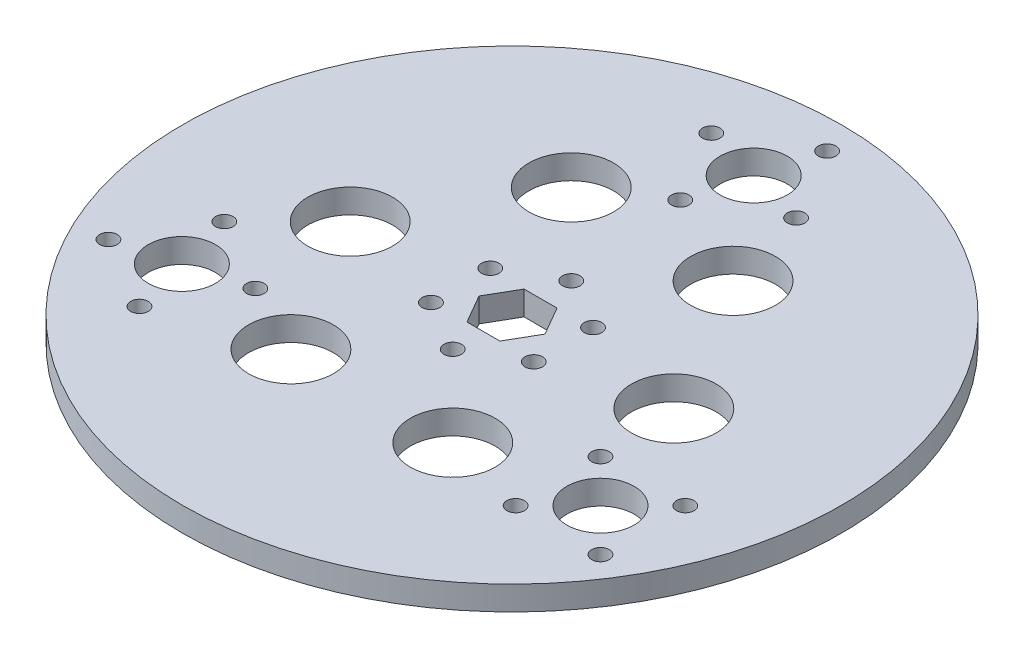
ISO-10303-21;
HEADER;
FILE_DESCRIPTION(('STEP AP214'),'2;1');
FILE_NAME('part.step','',(''),(''),'','','');
FILE_SCHEMA(('AUTOMOTIVE_DESIGN { 1 0 10303 214 1 1 1 1 }'));
ENDSEC;
DATA;
#1=APPLICATION_CONTEXT('core data for automotive mechanical design processes');
#2=APPLICATION_PROTOCOL_DEFINITION('international standard','automotive_design',2000,#1);
#3=PRODUCT_CONTEXT('',#1,'mechanical');
#4=PRODUCT('Part','Part','',(#3));
#5=PRODUCT_RELATED_PRODUCT_CATEGORY('part','',(#4));
#6=PRODUCT_DEFINITION_FORMATION('','',#4);
#7=PRODUCT_DEFINITION_CONTEXT('part definition',#1,'design');
#8=PRODUCT_DEFINITION('design','',#6,#7);
#9=PRODUCT_DEFINITION_SHAPE('','',#8);
#10=(LENGTH_UNIT() NAMED_UNIT(*) SI_UNIT(.MILLI.,.METRE.));
#11=(NAMED_UNIT(*) PLANE_ANGLE_UNIT() SI_UNIT($,.RADIAN.));
#12=(NAMED_UNIT(*) SI_UNIT($,.STERADIAN.) SOLID_ANGLE_UNIT());
#13=UNCERTAINTY_MEASURE_WITH_UNIT(LENGTH_MEASURE(1.E-05),#10,'distance_accuracy_value','');
#14=(GEOMETRIC_REPRESENTATION_CONTEXT(3) GLOBAL_UNCERTAINTY_ASSIGNED_CONTEXT((#13)) GLOBAL_UNIT_ASSIGNED_CONTEXT((#10,
#11,#12)) REPRESENTATION_CONTEXT('',''));
#15=CARTESIAN_POINT('',(0.,0.,0.));
#16=DIRECTION('',(0.,0.,1.));
#17=DIRECTION('',(1.,0.,0.));
#18=AXIS2_PLACEMENT_3D('',#15,#16,#17);
#19=CARTESIAN_POINT('',(0.,5.5,0.));
#20=DIRECTION('',(0.,1.,0.));
#21=DIRECTION('',(0.,0.,1.));
#22=AXIS2_PLACEMENT_3D('',#19,#20,#21);
#23=PLANE('',#22);
#24=CARTESIAN_POINT('',(-13.1848875288454,5.5,-58.5328799656496));
#25=DIRECTION('',(0.,1.,0.));
#26=DIRECTION('',(0.,0.,1.));
#27=AXIS2_PLACEMENT_3D('',#24,#25,#26);
#28=CIRCLE('',#27,2.);
#29=CARTESIAN_POINT('',(-13.1848875288454,5.5,-56.5328799656496));
#30=VERTEX_POINT('',#29);
#31=EDGE_CURVE('E208',#30,#30,#28,.T.);
#32=ORIENTED_EDGE('',*,*,#31,.F.);
#33=EDGE_LOOP('',(#32));
#34=FACE_BOUND('',#33,.T.);
#35=CARTESIAN_POINT('',(13.1848875288461,5.5,-51.4671200343505));
#36=DIRECTION('',(0.,1.,0.));
#37=DIRECTION('',(0.,0.,1.));
#38=AXIS2_PLACEMENT_3D('',#35,#36,#37);
#39=CIRCLE('',#38,2.);
#40=CARTESIAN_POINT('',(13.1848875288461,5.5,-49.4671200343505));
#41=VERTEX_POINT('',#40);
#42=EDGE_CURVE('E212',#41,#41,#39,.T.);
#43=ORIENTED_EDGE('',*,*,#42,.F.);
#44=EDGE_LOOP('',(#43));
#45=FACE_BOUND('',#44,.T.);
#46=CARTESIAN_POINT('',(-44.0985172424949,5.5,40.6848875288457));
#47=DIRECTION('',(0.,1.,0.));
#48=DIRECTION('',(0.,0.,1.));
#49=AXIS2_PLACEMENT_3D('',#46,#47,#48);
#50=CIRCLE('',#49,2.);
#51=CARTESIAN_POINT('',(-44.0985172424949,5.5,42.6848875288457));
#52=VERTEX_POINT('',#51);
#53=EDGE_CURVE('E216',#52,#52,#50,.T.);
#54=ORIENTED_EDGE('',*,*,#53,.F.);
#55=EDGE_LOOP('',(#54));
#56=FACE_BOUND('',#55,.T.);
#57=CARTESIAN_POINT('',(-51.1642771737935,5.5,14.3151124711541));
#58=DIRECTION('',(0.,1.,0.));
#59=DIRECTION('',(0.,0.,1.));
#60=AXIS2_PLACEMENT_3D('',#57,#58,#59);
#61=CIRCLE('',#60,2.00000000000001);
#62=CARTESIAN_POINT('',(-51.1642771737935,5.5,16.3151124711541));
#63=VERTEX_POINT('',#62);
#64=EDGE_CURVE('E220',#63,#63,#61,.T.);
#65=ORIENTED_EDGE('',*,*,#64,.F.);
#66=EDGE_LOOP('',(#65));
#67=FACE_BOUND('',#66,.T.);
#68=CARTESIAN_POINT('',(57.2834047713406,5.5,17.8479924368036));
#69=DIRECTION('',(0.,1.,0.));
#70=DIRECTION('',(0.,0.,1.));
#71=AXIS2_PLACEMENT_3D('',#68,#69,#70);
#72=CIRCLE('',#71,2.);
#73=CARTESIAN_POINT('',(57.2834047713406,5.5,19.8479924368036));
#74=VERTEX_POINT('',#73);
#75=EDGE_CURVE('E224',#74,#74,#72,.T.);
#76=ORIENTED_EDGE('',*,*,#75,.F.);
#77=EDGE_LOOP('',(#76));
#78=FACE_BOUND('',#77,.T.);
#79=CARTESIAN_POINT('',(37.9793896449478,5.5,37.1520075631962));
#80=DIRECTION('',(0.,1.,0.));
#81=DIRECTION('',(0.,0.,1.));
#82=AXIS2_PLACEMENT_3D('',#79,#80,#81);
#83=CIRCLE('',#82,2.);
#84=CARTESIAN_POINT('',(37.9793896449478,5.5,39.1520075631962));
#85=VERTEX_POINT('',#84);
#86=EDGE_CURVE('E228',#85,#85,#83,.T.);
#87=ORIENTED_EDGE('',*,*,#86,.F.);
#88=EDGE_LOOP('',(#87));
#89=FACE_BOUND('',#88,.T.);
#90=CARTESIAN_POINT('',(-11.6913429510899,5.5,-6.74999999999999));
#91=DIRECTION('',(0.,1.,0.));
#92=DIRECTION('',(0.,0.,1.));
#93=AXIS2_PLACEMENT_3D('',#90,#91,#92);
#94=CIRCLE('',#93,2.);
#95=CARTESIAN_POINT('',(-11.6913429510899,5.5,-4.74999999999999));
#96=VERTEX_POINT('',#95);
#97=EDGE_CURVE('E232',#96,#96,#94,.T.);
#98=ORIENTED_EDGE('',*,*,#97,.F.);
#99=EDGE_LOOP('',(#98));
#100=FACE_BOUND('',#99,.T.);
#101=CARTESIAN_POINT('',(0.,5.5,13.5));
#102=DIRECTION('',(0.,1.,0.));
#103=DIRECTION('',(0.,0.,1.));
#104=AXIS2_PLACEMENT_3D('',#101,#102,#103);
#105=CIRCLE('',#104,2.00000000000012);
#106=CARTESIAN_POINT('',(0.,5.5,15.5000000000001));
#107=VERTEX_POINT('',#106);
#108=EDGE_CURVE('E236',#107,#107,#105,.T.);
#109=ORIENTED_EDGE('',*,*,#108,.F.);
#110=EDGE_LOOP('',(#109));
#111=FACE_BOUND('',#110,.T.);
#112=CARTESIAN_POINT('',(11.6913429510899,5.5,-6.75));
#113=DIRECTION('',(0.,1.,0.));
#114=DIRECTION('',(0.,0.,1.));
#115=AXIS2_PLACEMENT_3D('',#112,#113,#114);
#116=CIRCLE('',#115,2.);
#117=CARTESIAN_POINT('',(11.6913429510899,5.5,-4.75));
#118=VERTEX_POINT('',#117);
#119=EDGE_CURVE('E240',#118,#118,#116,.T.);
#120=ORIENTED_EDGE('',*,*,#119,.F.);
#121=EDGE_LOOP('',(#120));
#122=FACE_BOUND('',#121,.T.);
#123=CARTESIAN_POINT('',(0.,5.5,-13.5));
#124=DIRECTION('',(0.,1.,0.));
#125=DIRECTION('',(0.,0.,1.));
#126=AXIS2_PLACEMENT_3D('',#123,#124,#125);
#127=CIRCLE('',#126,2.);
#128=CARTESIAN_POINT('',(0.,5.5,-11.5));
#129=VERTEX_POINT('',#128);
#130=EDGE_CURVE('E120',#129,#129,#127,.T.);
#131=ORIENTED_EDGE('',*,*,#130,.F.);
#132=EDGE_LOOP('',(#131));
#133=FACE_BOUND('',#132,.T.);
#134=CARTESIAN_POINT('',(18.4136960905577,5.5,31.8934571839783));
#135=DIRECTION('',(0.,1.,0.));
#136=DIRECTION('',(0.,0.,1.));
#137=AXIS2_PLACEMENT_3D('',#134,#135,#136);
#138=CIRCLE('',#137,9.65);
#139=CARTESIAN_POINT('',(18.4136960905577,5.5,41.5434571839783));
#140=VERTEX_POINT('',#139);
#141=EDGE_CURVE('E146',#140,#140,#138,.T.);
#142=ORIENTED_EDGE('',*,*,#141,.F.);
#143=EDGE_LOOP('',(#142));
#144=FACE_BOUND('',#143,.T.);
#145=CARTESIAN_POINT('',(18.4136960905577,5.5,-31.8934571839783));
#146=DIRECTION('',(0.,1.,0.));
#147=DIRECTION('',(0.,0.,1.));
#148=AXIS2_PLACEMENT_3D('',#145,#146,#147);
#149=CIRCLE('',#148,9.65000000000001);
#150=CARTESIAN_POINT('',(18.4136960905577,5.5,-22.2434571839783));
#151=VERTEX_POINT('',#150);
#152=EDGE_CURVE('E158',#151,#151,#149,.T.);
#153=ORIENTED_EDGE('',*,*,#152,.F.);
#154=EDGE_LOOP('',(#153));
#155=FACE_BOUND('',#154,.T.);
#156=CARTESIAN_POINT('',(-18.4136960905577,5.5,-31.8934571839783));
#157=DIRECTION('',(0.,1.,0.));
#158=DIRECTION('',(0.,0.,1.));
#159=AXIS2_PLACEMENT_3D('',#156,#157,#158);
#160=CIRCLE('',#159,9.65);
#161=CARTESIAN_POINT('',(-18.4136960905577,5.5,-22.2434571839783));
#162=VERTEX_POINT('',#161);
#163=EDGE_CURVE('E170',#162,#162,#160,.T.);
#164=ORIENTED_EDGE('',*,*,#163,.F.);
#165=EDGE_LOOP('',(#164));
#166=FACE_BOUND('',#165,.T.);
#167=CARTESIAN_POINT('',(0.,5.5,0.));
#168=DIRECTION('',(0.,1.,0.));
#169=DIRECTION('',(0.,0.,1.));
#170=AXIS2_PLACEMENT_3D('',#167,#168,#169);
#171=CIRCLE('',#170,75.);
#172=CARTESIAN_POINT('',(0.,5.5,75.));
#173=VERTEX_POINT('',#172);
#174=EDGE_CURVE('E11',#173,#173,#171,.T.);
#175=ORIENTED_EDGE('',*,*,#174,.T.);
#176=EDGE_LOOP('',(#175));
#177=FACE_BOUND('',#176,.T.);
#178=CARTESIAN_POINT('',(-36.8273921811154,5.5,0.));
#179=DIRECTION('',(0.,1.,0.));
#180=DIRECTION('',(0.,0.,1.));
#181=AXIS2_PLACEMENT_3D('',#178,#179,#180);
#182=CIRCLE('',#181,9.65);
#183=CARTESIAN_POINT('',(-36.8273921811154,5.5,9.65000000000001));
#184=VERTEX_POINT('',#183);
#185=EDGE_CURVE('E176',#184,#184,#182,.T.);
#186=ORIENTED_EDGE('',*,*,#185,.F.);
#187=EDGE_LOOP('',(#186));
#188=FACE_BOUND('',#187,.T.);
#189=CARTESIAN_POINT('',(0.,5.5,-55.));
#190=DIRECTION('',(0.,1.,0.));
#191=DIRECTION('',(0.,0.,1.));
#192=AXIS2_PLACEMENT_3D('',#189,#190,#191);
#193=CIRCLE('',#192,7.65);
#194=CARTESIAN_POINT('',(0.,5.5,-47.35));
#195=VERTEX_POINT('',#194);
#196=EDGE_CURVE('E164',#195,#195,#193,.T.);
#197=ORIENTED_EDGE('',*,*,#196,.F.);
#198=EDGE_LOOP('',(#197));
#199=FACE_BOUND('',#198,.T.);
#200=CARTESIAN_POINT('',(36.8273921811154,5.5,0.));
#201=DIRECTION('',(0.,1.,0.));
#202=DIRECTION('',(0.,0.,1.));
#203=AXIS2_PLACEMENT_3D('',#200,#201,#202);
#204=CIRCLE('',#203,9.65000000000001);
#205=CARTESIAN_POINT('',(36.8273921811154,5.5,9.64999999999999));
#206=VERTEX_POINT('',#205);
#207=EDGE_CURVE('E152',#206,#206,#204,.T.);
#208=ORIENTED_EDGE('',*,*,#207,.F.);
#209=EDGE_LOOP('',(#208));
#210=FACE_BOUND('',#209,.T.);
#211=CARTESIAN_POINT('',(-18.4136960905577,5.5,31.8934571839784));
#212=DIRECTION('',(0.,1.,0.));
#213=DIRECTION('',(0.,0.,1.));
#214=AXIS2_PLACEMENT_3D('',#211,#212,#213);
#215=CIRCLE('',#214,9.65000000000001);
#216=CARTESIAN_POINT('',(-18.4136960905577,5.5,41.5434571839784));
#217=VERTEX_POINT('',#216);
#218=EDGE_CURVE('E140',#217,#217,#215,.T.);
#219=ORIENTED_EDGE('',*,*,#218,.F.);
#220=EDGE_LOOP('',(#219));
#221=FACE_BOUND('',#220,.T.);
#222=DIRECTION('',(0.5,0.,-0.866025403784439));
#223=VECTOR('',#222,1.);
#224=CARTESIAN_POINT('',(3.75277674973257,5.5,6.5));
#225=LINE('',#224,#223);
#226=CARTESIAN_POINT('',(3.75277674973257,5.5,6.5));
#227=VERTEX_POINT('',#226);
#228=CARTESIAN_POINT('',(7.50555349946513,5.5,0.));
#229=VERTEX_POINT('',#228);
#230=EDGE_CURVE('E94',#227,#229,#225,.T.);
#231=ORIENTED_EDGE('',*,*,#230,.F.);
#232=DIRECTION('',(1.,0.,0.));
#233=VECTOR('',#232,1.);
#234=CARTESIAN_POINT('',(-3.75277674973257,5.5,6.5));
#235=LINE('',#234,#233);
#236=CARTESIAN_POINT('',(-3.75277674973257,5.5,6.5));
#237=VERTEX_POINT('',#236);
#238=EDGE_CURVE('E86',#237,#227,#235,.T.);
#239=ORIENTED_EDGE('',*,*,#238,.F.);
#240=DIRECTION('',(0.5,0.,0.866025403784439));
#241=VECTOR('',#240,1.);
#242=CARTESIAN_POINT('',(-7.50555349946513,5.5,0.));
#243=LINE('',#242,#241);
#244=CARTESIAN_POINT('',(-7.50555349946513,5.5,0.));
#245=VERTEX_POINT('',#244);
#246=EDGE_CURVE('E117',#245,#237,#243,.T.);
#247=ORIENTED_EDGE('',*,*,#246,.F.);
#248=DIRECTION('',(-0.5,0.,0.866025403784439));
#249=VECTOR('',#248,1.);
#250=CARTESIAN_POINT('',(-3.75277674973257,5.5,-6.5));
#251=LINE('',#250,#249);
#252=CARTESIAN_POINT('',(-3.75277674973257,5.5,-6.5));
#253=VERTEX_POINT('',#252);
#254=EDGE_CURVE('E115',#253,#245,#251,.T.);
#255=ORIENTED_EDGE('',*,*,#254,.F.);
#256=DIRECTION('',(-1.,0.,0.));
#257=VECTOR('',#256,1.);
#258=CARTESIAN_POINT('',(3.75277674973256,5.5,-6.5));
#259=LINE('',#258,#257);
#260=CARTESIAN_POINT('',(3.75277674973256,5.5,-6.5));
#261=VERTEX_POINT('',#260);
#262=EDGE_CURVE('E110',#261,#253,#259,.T.);
#263=ORIENTED_EDGE('',*,*,#262,.F.);
#264=DIRECTION('',(-0.5,0.,-0.866025403784438));
#265=VECTOR('',#264,1.);
#266=CARTESIAN_POINT('',(7.50555349946513,5.5,0.));
#267=LINE('',#266,#265);
#268=EDGE_CURVE('E108',#229,#261,#267,.T.);
#269=ORIENTED_EDGE('',*,*,#268,.F.);
#270=EDGE_LOOP('',(#231,#239,#247,#255,#263,#269));
#271=FACE_BOUND('',#270,.T.);
#272=CARTESIAN_POINT('',(47.6313972081483,5.5,27.4999999999976));
#273=DIRECTION('',(0.,1.,0.));
#274=DIRECTION('',(0.,0.,1.));
#275=AXIS2_PLACEMENT_3D('',#272,#273,#274);
#276=CIRCLE('',#275,7.65);
#277=CARTESIAN_POINT('',(47.6313972081483,5.5,35.1499999999976));
#278=VERTEX_POINT('',#277);
#279=EDGE_CURVE('E491',#278,#278,#276,.T.);
#280=ORIENTED_EDGE('',*,*,#279,.F.);
#281=EDGE_LOOP('',(#280));
#282=FACE_BOUND('',#281,.T.);
#283=CARTESIAN_POINT('',(11.6913429510899,5.5,6.75));
#284=DIRECTION('',(0.,1.,0.));
#285=DIRECTION('',(0.,0.,1.));
#286=AXIS2_PLACEMENT_3D('',#283,#284,#285);
#287=CIRCLE('',#286,2.00000000000009);
#288=CARTESIAN_POINT('',(11.6913429510899,5.5,8.75000000000008));
#289=VERTEX_POINT('',#288);
#290=EDGE_CURVE('E481',#289,#289,#287,.T.);
#291=ORIENTED_EDGE('',*,*,#290,.F.);
#292=EDGE_LOOP('',(#291));
#293=FACE_BOUND('',#292,.T.);
#294=CARTESIAN_POINT('',(-11.6913429510899,5.5,6.75000000000001));
#295=DIRECTION('',(0.,1.,0.));
#296=DIRECTION('',(0.,0.,1.));
#297=AXIS2_PLACEMENT_3D('',#294,#295,#296);
#298=CIRCLE('',#297,2.00000000000018);
#299=CARTESIAN_POINT('',(-11.6913429510899,5.5,8.75000000000018));
#300=VERTEX_POINT('',#299);
#301=EDGE_CURVE('E471',#300,#300,#298,.T.);
#302=ORIENTED_EDGE('',*,*,#301,.F.);
#303=EDGE_LOOP('',(#302));
#304=FACE_BOUND('',#303,.T.);
#305=CARTESIAN_POINT('',(-47.63139720814,5.5,27.5000000000024));
#306=DIRECTION('',(0.,1.,0.));
#307=DIRECTION('',(0.,0.,1.));
#308=AXIS2_PLACEMENT_3D('',#305,#306,#307);
#309=CIRCLE('',#308,7.65);
#310=CARTESIAN_POINT('',(-47.63139720814,5.5,35.1500000000024));
#311=VERTEX_POINT('',#310);
#312=EDGE_CURVE('E461',#311,#311,#309,.T.);
#313=ORIENTED_EDGE('',*,*,#312,.F.);
#314=EDGE_LOOP('',(#313));
#315=FACE_BOUND('',#314,.T.);
#316=CARTESIAN_POINT('',(37.9793896449479,5.5,17.8479924368035));
#317=DIRECTION('',(0.,1.,0.));
#318=DIRECTION('',(0.,0.,1.));
#319=AXIS2_PLACEMENT_3D('',#316,#317,#318);
#320=CIRCLE('',#319,2.00000000000001);
#321=CARTESIAN_POINT('',(37.9793896449479,5.5,19.8479924368035));
#322=VERTEX_POINT('',#321);
#323=EDGE_CURVE('E451',#322,#322,#320,.T.);
#324=ORIENTED_EDGE('',*,*,#323,.F.);
#325=EDGE_LOOP('',(#324));
#326=FACE_BOUND('',#325,.T.);
#327=CARTESIAN_POINT('',(57.2834047713405,5.5,37.1520075631963));
#328=DIRECTION('',(0.,1.,0.));
#329=DIRECTION('',(0.,0.,1.));
#330=AXIS2_PLACEMENT_3D('',#327,#328,#329);
#331=CIRCLE('',#330,2.);
#332=CARTESIAN_POINT('',(57.2834047713405,5.5,39.1520075631964));
#333=VERTEX_POINT('',#332);
#334=EDGE_CURVE('E441',#333,#333,#331,.T.);
#335=ORIENTED_EDGE('',*,*,#334,.F.);
#336=EDGE_LOOP('',(#335));
#337=FACE_BOUND('',#336,.T.);
#338=CARTESIAN_POINT('',(-34.4465096792984,5.5,23.9671200343506));
#339=DIRECTION('',(0.,1.,0.));
#340=DIRECTION('',(0.,0.,1.));
#341=AXIS2_PLACEMENT_3D('',#338,#339,#340);
#342=CIRCLE('',#341,2.);
#343=CARTESIAN_POINT('',(-34.4465096792984,5.5,25.9671200343506));
#344=VERTEX_POINT('',#343);
#345=EDGE_CURVE('E431',#344,#344,#342,.T.);
#346=ORIENTED_EDGE('',*,*,#345,.F.);
#347=EDGE_LOOP('',(#346));
#348=FACE_BOUND('',#347,.T.);
#349=CARTESIAN_POINT('',(-60.81628473699,5.5,31.0328799656491));
#350=DIRECTION('',(0.,1.,0.));
#351=DIRECTION('',(0.,0.,1.));
#352=AXIS2_PLACEMENT_3D('',#349,#350,#351);
#353=CIRCLE('',#352,2.00000000000001);
#354=CARTESIAN_POINT('',(-60.81628473699,5.5,33.0328799656491));
#355=VERTEX_POINT('',#354);
#356=EDGE_CURVE('E421',#355,#355,#353,.T.);
#357=ORIENTED_EDGE('',*,*,#356,.F.);
#358=EDGE_LOOP('',(#357));
#359=FACE_BOUND('',#358,.T.);
#360=CARTESIAN_POINT('',(-3.53287996564922,5.5,-41.8151124711543));
#361=DIRECTION('',(0.,1.,0.));
#362=DIRECTION('',(0.,0.,1.));
#363=AXIS2_PLACEMENT_3D('',#360,#361,#362);
#364=CIRCLE('',#363,2.);
#365=CARTESIAN_POINT('',(-3.53287996564922,5.5,-39.8151124711543));
#366=VERTEX_POINT('',#365);
#367=EDGE_CURVE('E411',#366,#366,#364,.T.);
#368=ORIENTED_EDGE('',*,*,#367,.F.);
#369=EDGE_LOOP('',(#368));
#370=FACE_BOUND('',#369,.T.);
#371=CARTESIAN_POINT('',(3.53287996565003,5.5,-68.1848875288457));
#372=DIRECTION('',(0.,1.,0.));
#373=DIRECTION('',(0.,0.,1.));
#374=AXIS2_PLACEMENT_3D('',#371,#372,#373);
#375=CIRCLE('',#374,2.);
#376=CARTESIAN_POINT('',(3.53287996565003,5.5,-66.1848875288457));
#377=VERTEX_POINT('',#376);
#378=EDGE_CURVE('E398',#377,#377,#375,.T.);
#379=ORIENTED_EDGE('',*,*,#378,.F.);
#380=EDGE_LOOP('',(#379));
#381=FACE_BOUND('',#380,.T.);
#382=ADVANCED_FACE('F33',(#34,#45,#56,#67,#78,#89,#100,#111,#122,#133,#144,#155,#166,#177,#188,
#199,#210,#221,#271,#282,#293,#304,#315,#326,#337,#348,#359,#370,#381),#23,.T.);
#383=CARTESIAN_POINT('',(0.,0.,0.));
#384=DIRECTION('',(0.,1.,0.));
#385=DIRECTION('',(0.,0.,1.));
#386=AXIS2_PLACEMENT_3D('',#383,#384,#385);
#387=PLANE('',#386);
#388=CARTESIAN_POINT('',(-18.4136960905577,0.,31.8934571839784));
#389=DIRECTION('',(0.,1.,0.));
#390=DIRECTION('',(0.,0.,1.));
#391=AXIS2_PLACEMENT_3D('',#388,#389,#390);
#392=CIRCLE('',#391,9.65000000000001);
#393=CARTESIAN_POINT('',(-18.4136960905577,0.,41.5434571839784));
#394=VERTEX_POINT('',#393);
#395=EDGE_CURVE('E102',#394,#394,#392,.T.);
#396=ORIENTED_EDGE('',*,*,#395,.T.);
#397=EDGE_LOOP('',(#396));
#398=FACE_BOUND('',#397,.T.);
#399=CARTESIAN_POINT('',(18.4136960905577,0.,31.8934571839783));
#400=DIRECTION('',(0.,1.,0.));
#401=DIRECTION('',(0.,0.,1.));
#402=AXIS2_PLACEMENT_3D('',#399,#400,#401);
#403=CIRCLE('',#402,9.65);
#404=CARTESIAN_POINT('',(18.4136960905577,0.,41.5434571839783));
#405=VERTEX_POINT('',#404);
#406=EDGE_CURVE('E143',#405,#405,#403,.T.);
#407=ORIENTED_EDGE('',*,*,#406,.T.);
#408=EDGE_LOOP('',(#407));
#409=FACE_BOUND('',#408,.T.);
#410=CARTESIAN_POINT('',(36.8273921811154,0.,0.));
#411=DIRECTION('',(0.,1.,0.));
#412=DIRECTION('',(0.,0.,1.));
#413=AXIS2_PLACEMENT_3D('',#410,#411,#412);
#414=CIRCLE('',#413,9.65000000000001);
#415=CARTESIAN_POINT('',(36.8273921811154,0.,9.64999999999999));
#416=VERTEX_POINT('',#415);
#417=EDGE_CURVE('E149',#416,#416,#414,.T.);
#418=ORIENTED_EDGE('',*,*,#417,.T.);
#419=EDGE_LOOP('',(#418));
#420=FACE_BOUND('',#419,.T.);
#421=CARTESIAN_POINT('',(18.4136960905577,0.,-31.8934571839783));
#422=DIRECTION('',(0.,1.,0.));
#423=DIRECTION('',(0.,0.,1.));
#424=AXIS2_PLACEMENT_3D('',#421,#422,#423);
#425=CIRCLE('',#424,9.65000000000001);
#426=CARTESIAN_POINT('',(18.4136960905577,0.,-22.2434571839783));
#427=VERTEX_POINT('',#426);
#428=EDGE_CURVE('E155',#427,#427,#425,.T.);
#429=ORIENTED_EDGE('',*,*,#428,.T.);
#430=EDGE_LOOP('',(#429));
#431=FACE_BOUND('',#430,.T.);
#432=CARTESIAN_POINT('',(0.,0.,-55.));
#433=DIRECTION('',(0.,1.,0.));
#434=DIRECTION('',(0.,0.,1.));
#435=AXIS2_PLACEMENT_3D('',#432,#433,#434);
#436=CIRCLE('',#435,7.65);
#437=CARTESIAN_POINT('',(0.,0.,-47.35));
#438=VERTEX_POINT('',#437);
#439=EDGE_CURVE('E161',#438,#438,#436,.T.);
#440=ORIENTED_EDGE('',*,*,#439,.T.);
#441=EDGE_LOOP('',(#440));
#442=FACE_BOUND('',#441,.T.);
#443=CARTESIAN_POINT('',(-18.4136960905577,0.,-31.8934571839783));
#444=DIRECTION('',(0.,1.,0.));
#445=DIRECTION('',(0.,0.,1.));
#446=AXIS2_PLACEMENT_3D('',#443,#444,#445);
#447=CIRCLE('',#446,9.65);
#448=CARTESIAN_POINT('',(-18.4136960905577,0.,-22.2434571839783));
#449=VERTEX_POINT('',#448);
#450=EDGE_CURVE('E167',#449,#449,#447,.T.);
#451=ORIENTED_EDGE('',*,*,#450,.T.);
#452=EDGE_LOOP('',(#451));
#453=FACE_BOUND('',#452,.T.);
#454=CARTESIAN_POINT('',(-36.8273921811154,0.,0.));
#455=DIRECTION('',(0.,1.,0.));
#456=DIRECTION('',(0.,0.,1.));
#457=AXIS2_PLACEMENT_3D('',#454,#455,#456);
#458=CIRCLE('',#457,9.65);
#459=CARTESIAN_POINT('',(-36.8273921811154,0.,9.65000000000001));
#460=VERTEX_POINT('',#459);
#461=EDGE_CURVE('E173',#460,#460,#458,.T.);
#462=ORIENTED_EDGE('',*,*,#461,.T.);
#463=EDGE_LOOP('',(#462));
#464=FACE_BOUND('',#463,.T.);
#465=CARTESIAN_POINT('',(0.,0.,0.));
#466=DIRECTION('',(0.,1.,0.));
#467=DIRECTION('',(0.,0.,1.));
#468=AXIS2_PLACEMENT_3D('',#465,#466,#467);
#469=CIRCLE('',#468,75.);
#470=CARTESIAN_POINT('',(0.,0.,75.));
#471=VERTEX_POINT('',#470);
#472=EDGE_CURVE('E37',#471,#471,#469,.T.);
#473=ORIENTED_EDGE('',*,*,#472,.F.);
#474=EDGE_LOOP('',(#473));
#475=FACE_BOUND('',#474,.T.);
#476=DIRECTION('',(1.,0.,0.));
#477=VECTOR('',#476,1.);
#478=CARTESIAN_POINT('',(-3.75277674973257,0.,6.5));
#479=LINE('',#478,#477);
#480=CARTESIAN_POINT('',(-3.75277674973257,0.,6.5));
#481=VERTEX_POINT('',#480);
#482=CARTESIAN_POINT('',(3.75277674973257,0.,6.5));
#483=VERTEX_POINT('',#482);
#484=EDGE_CURVE('E56',#481,#483,#479,.T.);
#485=ORIENTED_EDGE('',*,*,#484,.T.);
#486=DIRECTION('',(0.5,0.,-0.866025403784439));
#487=VECTOR('',#486,1.);
#488=CARTESIAN_POINT('',(3.75277674973257,0.,6.5));
#489=LINE('',#488,#487);
#490=CARTESIAN_POINT('',(7.50555349946513,0.,0.));
#491=VERTEX_POINT('',#490);
#492=EDGE_CURVE('E101',#483,#491,#489,.T.);
#493=ORIENTED_EDGE('',*,*,#492,.T.);
#494=DIRECTION('',(-0.5,0.,-0.866025403784438));
#495=VECTOR('',#494,1.);
#496=CARTESIAN_POINT('',(7.50555349946513,0.,0.));
#497=LINE('',#496,#495);
#498=CARTESIAN_POINT('',(3.75277674973256,0.,-6.5));
#499=VERTEX_POINT('',#498);
#500=EDGE_CURVE('E122',#491,#499,#497,.T.);
#501=ORIENTED_EDGE('',*,*,#500,.T.);
#502=DIRECTION('',(-1.,0.,0.));
#503=VECTOR('',#502,1.);
#504=CARTESIAN_POINT('',(3.75277674973256,0.,-6.5));
#505=LINE('',#504,#503);
#506=CARTESIAN_POINT('',(-3.75277674973257,0.,-6.5));
#507=VERTEX_POINT('',#506);
#508=EDGE_CURVE('E125',#499,#507,#505,.T.);
#509=ORIENTED_EDGE('',*,*,#508,.T.);
#510=DIRECTION('',(-0.5,0.,0.866025403784439));
#511=VECTOR('',#510,1.);
#512=CARTESIAN_POINT('',(-3.75277674973257,0.,-6.5));
#513=LINE('',#512,#511);
#514=CARTESIAN_POINT('',(-7.50555349946513,0.,0.));
#515=VERTEX_POINT('',#514);
#516=EDGE_CURVE('E128',#507,#515,#513,.T.);
#517=ORIENTED_EDGE('',*,*,#516,.T.);
#518=DIRECTION('',(0.5,0.,0.866025403784439));
#519=VECTOR('',#518,1.);
#520=CARTESIAN_POINT('',(-7.50555349946513,0.,0.));
#521=LINE('',#520,#519);
#522=EDGE_CURVE('E95',#515,#481,#521,.T.);
#523=ORIENTED_EDGE('',*,*,#522,.T.);
#524=EDGE_LOOP('',(#485,#493,#501,#509,#517,#523));
#525=FACE_BOUND('',#524,.T.);
#526=CARTESIAN_POINT('',(0.,0.,-13.5));
#527=DIRECTION('',(0.,1.,0.));
#528=DIRECTION('',(0.,0.,1.));
#529=AXIS2_PLACEMENT_3D('',#526,#527,#528);
#530=CIRCLE('',#529,2.);
#531=CARTESIAN_POINT('',(0.,0.,-11.5));
#532=VERTEX_POINT('',#531);
#533=EDGE_CURVE('E494',#532,#532,#530,.T.);
#534=ORIENTED_EDGE('',*,*,#533,.T.);
#535=EDGE_LOOP('',(#534));
#536=FACE_BOUND('',#535,.T.);
#537=CARTESIAN_POINT('',(47.6313972081483,0.,27.4999999999976));
#538=DIRECTION('',(0.,1.,0.));
#539=DIRECTION('',(0.,0.,1.));
#540=AXIS2_PLACEMENT_3D('',#537,#538,#539);
#541=CIRCLE('',#540,7.65);
#542=CARTESIAN_POINT('',(47.6313972081483,0.,35.1499999999976));
#543=VERTEX_POINT('',#542);
#544=EDGE_CURVE('E488',#543,#543,#541,.T.);
#545=ORIENTED_EDGE('',*,*,#544,.T.);
#546=EDGE_LOOP('',(#545));
#547=FACE_BOUND('',#546,.T.);
#548=CARTESIAN_POINT('',(11.6913429510899,0.,-6.75));
#549=DIRECTION('',(0.,1.,0.));
#550=DIRECTION('',(0.,0.,1.));
#551=AXIS2_PLACEMENT_3D('',#548,#549,#550);
#552=CIRCLE('',#551,2.);
#553=CARTESIAN_POINT('',(11.6913429510899,0.,-4.75));
#554=VERTEX_POINT('',#553);
#555=EDGE_CURVE('E484',#554,#554,#552,.T.);
#556=ORIENTED_EDGE('',*,*,#555,.T.);
#557=EDGE_LOOP('',(#556));
#558=FACE_BOUND('',#557,.T.);
#559=CARTESIAN_POINT('',(11.6913429510899,0.,6.75));
#560=DIRECTION('',(0.,1.,0.));
#561=DIRECTION('',(0.,0.,1.));
#562=AXIS2_PLACEMENT_3D('',#559,#560,#561);
#563=CIRCLE('',#562,2.00000000000009);
#564=CARTESIAN_POINT('',(11.6913429510899,0.,8.75000000000008));
#565=VERTEX_POINT('',#564);
#566=EDGE_CURVE('E478',#565,#565,#563,.T.);
#567=ORIENTED_EDGE('',*,*,#566,.T.);
#568=EDGE_LOOP('',(#567));
#569=FACE_BOUND('',#568,.T.);
#570=CARTESIAN_POINT('',(0.,0.,13.5));
#571=DIRECTION('',(0.,1.,0.));
#572=DIRECTION('',(0.,0.,1.));
#573=AXIS2_PLACEMENT_3D('',#570,#571,#572);
#574=CIRCLE('',#573,2.00000000000012);
#575=CARTESIAN_POINT('',(0.,0.,15.5000000000001));
#576=VERTEX_POINT('',#575);
#577=EDGE_CURVE('E474',#576,#576,#574,.T.);
#578=ORIENTED_EDGE('',*,*,#577,.T.);
#579=EDGE_LOOP('',(#578));
#580=FACE_BOUND('',#579,.T.);
#581=CARTESIAN_POINT('',(-11.6913429510899,0.,6.75000000000001));
#582=DIRECTION('',(0.,1.,0.));
#583=DIRECTION('',(0.,0.,1.));
#584=AXIS2_PLACEMENT_3D('',#581,#582,#583);
#585=CIRCLE('',#584,2.00000000000018);
#586=CARTESIAN_POINT('',(-11.6913429510899,0.,8.75000000000018));
#587=VERTEX_POINT('',#586);
#588=EDGE_CURVE('E468',#587,#587,#585,.T.);
#589=ORIENTED_EDGE('',*,*,#588,.T.);
#590=EDGE_LOOP('',(#589));
#591=FACE_BOUND('',#590,.T.);
#592=CARTESIAN_POINT('',(-11.6913429510899,0.,-6.74999999999999));
#593=DIRECTION('',(0.,1.,0.));
#594=DIRECTION('',(0.,0.,1.));
#595=AXIS2_PLACEMENT_3D('',#592,#593,#594);
#596=CIRCLE('',#595,2.);
#597=CARTESIAN_POINT('',(-11.6913429510899,0.,-4.74999999999999));
#598=VERTEX_POINT('',#597);
#599=EDGE_CURVE('E464',#598,#598,#596,.T.);
#600=ORIENTED_EDGE('',*,*,#599,.T.);
#601=EDGE_LOOP('',(#600));
#602=FACE_BOUND('',#601,.T.);
#603=CARTESIAN_POINT('',(-47.63139720814,0.,27.5000000000024));
#604=DIRECTION('',(0.,1.,0.));
#605=DIRECTION('',(0.,0.,1.));
#606=AXIS2_PLACEMENT_3D('',#603,#604,#605);
#607=CIRCLE('',#606,7.65);
#608=CARTESIAN_POINT('',(-47.63139720814,0.,35.1500000000024));
#609=VERTEX_POINT('',#608);
#610=EDGE_CURVE('E458',#609,#609,#607,.T.);
#611=ORIENTED_EDGE('',*,*,#610,.T.);
#612=EDGE_LOOP('',(#611));
#613=FACE_BOUND('',#612,.T.);
#614=CARTESIAN_POINT('',(37.9793896449478,0.,37.1520075631962));
#615=DIRECTION('',(0.,1.,0.));
#616=DIRECTION('',(0.,0.,1.));
#617=AXIS2_PLACEMENT_3D('',#614,#615,#616);
#618=CIRCLE('',#617,2.);
#619=CARTESIAN_POINT('',(37.9793896449478,0.,39.1520075631962));
#620=VERTEX_POINT('',#619);
#621=EDGE_CURVE('E454',#620,#620,#618,.T.);
#622=ORIENTED_EDGE('',*,*,#621,.T.);
#623=EDGE_LOOP('',(#622));
#624=FACE_BOUND('',#623,.T.);
#625=CARTESIAN_POINT('',(37.9793896449479,0.,17.8479924368035));
#626=DIRECTION('',(0.,1.,0.));
#627=DIRECTION('',(0.,0.,1.));
#628=AXIS2_PLACEMENT_3D('',#625,#626,#627);
#629=CIRCLE('',#628,2.00000000000001);
#630=CARTESIAN_POINT('',(37.9793896449479,0.,19.8479924368035));
#631=VERTEX_POINT('',#630);
#632=EDGE_CURVE('E448',#631,#631,#629,.T.);
#633=ORIENTED_EDGE('',*,*,#632,.T.);
#634=EDGE_LOOP('',(#633));
#635=FACE_BOUND('',#634,.T.);
#636=CARTESIAN_POINT('',(57.2834047713406,0.,17.8479924368036));
#637=DIRECTION('',(0.,1.,0.));
#638=DIRECTION('',(0.,0.,1.));
#639=AXIS2_PLACEMENT_3D('',#636,#637,#638);
#640=CIRCLE('',#639,2.);
#641=CARTESIAN_POINT('',(57.2834047713406,0.,19.8479924368036));
#642=VERTEX_POINT('',#641);
#643=EDGE_CURVE('E444',#642,#642,#640,.T.);
#644=ORIENTED_EDGE('',*,*,#643,.T.);
#645=EDGE_LOOP('',(#644));
#646=FACE_BOUND('',#645,.T.);
#647=CARTESIAN_POINT('',(57.2834047713405,0.,37.1520075631963));
#648=DIRECTION('',(0.,1.,0.));
#649=DIRECTION('',(0.,0.,1.));
#650=AXIS2_PLACEMENT_3D('',#647,#648,#649);
#651=CIRCLE('',#650,2.);
#652=CARTESIAN_POINT('',(57.2834047713405,0.,39.1520075631964));
#653=VERTEX_POINT('',#652);
#654=EDGE_CURVE('E438',#653,#653,#651,.T.);
#655=ORIENTED_EDGE('',*,*,#654,.T.);
#656=EDGE_LOOP('',(#655));
#657=FACE_BOUND('',#656,.T.);
#658=CARTESIAN_POINT('',(-51.1642771737935,0.,14.3151124711541));
#659=DIRECTION('',(0.,1.,0.));
#660=DIRECTION('',(0.,0.,1.));
#661=AXIS2_PLACEMENT_3D('',#658,#659,#660);
#662=CIRCLE('',#661,2.00000000000001);
#663=CARTESIAN_POINT('',(-51.1642771737935,0.,16.3151124711541));
#664=VERTEX_POINT('',#663);
#665=EDGE_CURVE('E434',#664,#664,#662,.T.);
#666=ORIENTED_EDGE('',*,*,#665,.T.);
#667=EDGE_LOOP('',(#666));
#668=FACE_BOUND('',#667,.T.);
#669=CARTESIAN_POINT('',(-34.4465096792984,0.,23.9671200343506));
#670=DIRECTION('',(0.,1.,0.));
#671=DIRECTION('',(0.,0.,1.));
#672=AXIS2_PLACEMENT_3D('',#669,#670,#671);
#673=CIRCLE('',#672,2.);
#674=CARTESIAN_POINT('',(-34.4465096792984,0.,25.9671200343506));
#675=VERTEX_POINT('',#674);
#676=EDGE_CURVE('E428',#675,#675,#673,.T.);
#677=ORIENTED_EDGE('',*,*,#676,.T.);
#678=EDGE_LOOP('',(#677));
#679=FACE_BOUND('',#678,.T.);
#680=CARTESIAN_POINT('',(-44.0985172424949,0.,40.6848875288457));
#681=DIRECTION('',(0.,1.,0.));
#682=DIRECTION('',(0.,0.,1.));
#683=AXIS2_PLACEMENT_3D('',#680,#681,#682);
#684=CIRCLE('',#683,2.);
#685=CARTESIAN_POINT('',(-44.0985172424949,0.,42.6848875288457));
#686=VERTEX_POINT('',#685);
#687=EDGE_CURVE('E424',#686,#686,#684,.T.);
#688=ORIENTED_EDGE('',*,*,#687,.T.);
#689=EDGE_LOOP('',(#688));
#690=FACE_BOUND('',#689,.T.);
#691=CARTESIAN_POINT('',(-60.81628473699,0.,31.0328799656491));
#692=DIRECTION('',(0.,1.,0.));
#693=DIRECTION('',(0.,0.,1.));
#694=AXIS2_PLACEMENT_3D('',#691,#692,#693);
#695=CIRCLE('',#694,2.00000000000001);
#696=CARTESIAN_POINT('',(-60.81628473699,0.,33.0328799656491));
#697=VERTEX_POINT('',#696);
#698=EDGE_CURVE('E418',#697,#697,#695,.T.);
#699=ORIENTED_EDGE('',*,*,#698,.T.);
#700=EDGE_LOOP('',(#699));
#701=FACE_BOUND('',#700,.T.);
#702=CARTESIAN_POINT('',(13.1848875288461,0.,-51.4671200343505));
#703=DIRECTION('',(0.,1.,0.));
#704=DIRECTION('',(0.,0.,1.));
#705=AXIS2_PLACEMENT_3D('',#702,#703,#704);
#706=CIRCLE('',#705,2.);
#707=CARTESIAN_POINT('',(13.1848875288461,0.,-49.4671200343505));
#708=VERTEX_POINT('',#707);
#709=EDGE_CURVE('E414',#708,#708,#706,.T.);
#710=ORIENTED_EDGE('',*,*,#709,.T.);
#711=EDGE_LOOP('',(#710));
#712=FACE_BOUND('',#711,.T.);
#713=CARTESIAN_POINT('',(-3.53287996564922,0.,-41.8151124711543));
#714=DIRECTION('',(0.,1.,0.));
#715=DIRECTION('',(0.,0.,1.));
#716=AXIS2_PLACEMENT_3D('',#713,#714,#715);
#717=CIRCLE('',#716,2.);
#718=CARTESIAN_POINT('',(-3.53287996564922,0.,-39.8151124711543));
#719=VERTEX_POINT('',#718);
#720=EDGE_CURVE('E408',#719,#719,#717,.T.);
#721=ORIENTED_EDGE('',*,*,#720,.T.);
#722=EDGE_LOOP('',(#721));
#723=FACE_BOUND('',#722,.T.);
#724=CARTESIAN_POINT('',(-13.1848875288454,0.,-58.5328799656496));
#725=DIRECTION('',(0.,1.,0.));
#726=DIRECTION('',(0.,0.,1.));
#727=AXIS2_PLACEMENT_3D('',#724,#725,#726);
#728=CIRCLE('',#727,2.);
#729=CARTESIAN_POINT('',(-13.1848875288454,0.,-56.5328799656496));
#730=VERTEX_POINT('',#729);
#731=EDGE_CURVE('E404',#730,#730,#728,.T.);
#732=ORIENTED_EDGE('',*,*,#731,.T.);
#733=EDGE_LOOP('',(#732));
#734=FACE_BOUND('',#733,.T.);
#735=CARTESIAN_POINT('',(3.53287996565003,0.,-68.1848875288457));
#736=DIRECTION('',(0.,1.,0.));
#737=DIRECTION('',(0.,0.,1.));
#738=AXIS2_PLACEMENT_3D('',#735,#736,#737);
#739=CIRCLE('',#738,2.);
#740=CARTESIAN_POINT('',(3.53287996565003,0.,-66.1848875288457));
#741=VERTEX_POINT('',#740);
#742=EDGE_CURVE('E401',#741,#741,#739,.T.);
#743=ORIENTED_EDGE('',*,*,#742,.T.);
#744=EDGE_LOOP('',(#743));
#745=FACE_BOUND('',#744,.T.);
#746=ADVANCED_FACE('F182',(#398,#409,#420,#431,#442,#453,#464,#475,#525,#536,#547,#558,#569,
#580,#591,#602,#613,#624,#635,#646,#657,#668,#679,#690,#701,#712,#723,#734,#745),#387,.F.);
#747=CARTESIAN_POINT('',(0.,5.5,0.));
#748=DIRECTION('',(0.,-1.,0.));
#749=DIRECTION('',(0.,0.,-1.));
#750=AXIS2_PLACEMENT_3D('',#747,#748,#749);
#751=CYLINDRICAL_SURFACE('',#750,75.);
#752=ORIENTED_EDGE('',*,*,#174,.F.);
#753=EDGE_LOOP('',(#752));
#754=FACE_BOUND('',#753,.T.);
#755=ORIENTED_EDGE('',*,*,#472,.T.);
#756=EDGE_LOOP('',(#755));
#757=FACE_BOUND('',#756,.T.);
#758=ADVANCED_FACE('F35',(#754,#757),#751,.T.);
#759=CARTESIAN_POINT('',(-36.8273921811154,5.5,0.));
#760=DIRECTION('',(0.,-1.,0.));
#761=DIRECTION('',(0.,0.,-1.));
#762=AXIS2_PLACEMENT_3D('',#759,#760,#761);
#763=CYLINDRICAL_SURFACE('',#762,9.65);
#764=ORIENTED_EDGE('',*,*,#185,.T.);
#765=EDGE_LOOP('',(#764));
#766=FACE_BOUND('',#765,.T.);
#767=ORIENTED_EDGE('',*,*,#461,.F.);
#768=EDGE_LOOP('',(#767));
#769=FACE_BOUND('',#768,.T.);
#770=ADVANCED_FACE('F185',(#766,#769),#763,.F.);
#771=CARTESIAN_POINT('',(-18.4136960905577,5.5,-31.8934571839783));
#772=DIRECTION('',(0.,-1.,0.));
#773=DIRECTION('',(0.,0.,-1.));
#774=AXIS2_PLACEMENT_3D('',#771,#772,#773);
#775=CYLINDRICAL_SURFACE('',#774,9.65);
#776=ORIENTED_EDGE('',*,*,#163,.T.);
#777=EDGE_LOOP('',(#776));
#778=FACE_BOUND('',#777,.T.);
#779=ORIENTED_EDGE('',*,*,#450,.F.);
#780=EDGE_LOOP('',(#779));
#781=FACE_BOUND('',#780,.T.);
#782=ADVANCED_FACE('F187',(#778,#781),#775,.F.);
#783=CARTESIAN_POINT('',(0.,5.5,-55.));
#784=DIRECTION('',(0.,-1.,0.));
#785=DIRECTION('',(0.,0.,-1.));
#786=AXIS2_PLACEMENT_3D('',#783,#784,#785);
#787=CYLINDRICAL_SURFACE('',#786,7.65);
#788=ORIENTED_EDGE('',*,*,#196,.T.);
#789=EDGE_LOOP('',(#788));
#790=FACE_BOUND('',#789,.T.);
#791=ORIENTED_EDGE('',*,*,#439,.F.);
#792=EDGE_LOOP('',(#791));
#793=FACE_BOUND('',#792,.T.);
#794=ADVANCED_FACE('F194',(#790,#793),#787,.F.);
#795=CARTESIAN_POINT('',(18.4136960905577,5.5,-31.8934571839783));
#796=DIRECTION('',(0.,-1.,0.));
#797=DIRECTION('',(0.,0.,-1.));
#798=AXIS2_PLACEMENT_3D('',#795,#796,#797);
#799=CYLINDRICAL_SURFACE('',#798,9.65000000000001);
#800=ORIENTED_EDGE('',*,*,#152,.T.);
#801=EDGE_LOOP('',(#800));
#802=FACE_BOUND('',#801,.T.);
#803=ORIENTED_EDGE('',*,*,#428,.F.);
#804=EDGE_LOOP('',(#803));
#805=FACE_BOUND('',#804,.T.);
#806=ADVANCED_FACE('F279',(#802,#805),#799,.F.);
#807=CARTESIAN_POINT('',(36.8273921811154,5.5,0.));
#808=DIRECTION('',(0.,-1.,0.));
#809=DIRECTION('',(0.,0.,-1.));
#810=AXIS2_PLACEMENT_3D('',#807,#808,#809);
#811=CYLINDRICAL_SURFACE('',#810,9.65000000000001);
#812=ORIENTED_EDGE('',*,*,#207,.T.);
#813=EDGE_LOOP('',(#812));
#814=FACE_BOUND('',#813,.T.);
#815=ORIENTED_EDGE('',*,*,#417,.F.);
#816=EDGE_LOOP('',(#815));
#817=FACE_BOUND('',#816,.T.);
#818=ADVANCED_FACE('F285',(#814,#817),#811,.F.);
#819=CARTESIAN_POINT('',(18.4136960905577,5.5,31.8934571839783));
#820=DIRECTION('',(0.,-1.,0.));
#821=DIRECTION('',(0.,0.,-1.));
#822=AXIS2_PLACEMENT_3D('',#819,#820,#821);
#823=CYLINDRICAL_SURFACE('',#822,9.65);
#824=ORIENTED_EDGE('',*,*,#141,.T.);
#825=EDGE_LOOP('',(#824));
#826=FACE_BOUND('',#825,.T.);
#827=ORIENTED_EDGE('',*,*,#406,.F.);
#828=EDGE_LOOP('',(#827));
#829=FACE_BOUND('',#828,.T.);
#830=ADVANCED_FACE('F263',(#826,#829),#823,.F.);
#831=CARTESIAN_POINT('',(-18.4136960905577,5.5,31.8934571839784));
#832=DIRECTION('',(0.,-1.,0.));
#833=DIRECTION('',(0.,0.,-1.));
#834=AXIS2_PLACEMENT_3D('',#831,#832,#833);
#835=CYLINDRICAL_SURFACE('',#834,9.65000000000001);
#836=ORIENTED_EDGE('',*,*,#218,.T.);
#837=EDGE_LOOP('',(#836));
#838=FACE_BOUND('',#837,.T.);
#839=ORIENTED_EDGE('',*,*,#395,.F.);
#840=EDGE_LOOP('',(#839));
#841=FACE_BOUND('',#840,.T.);
#842=ADVANCED_FACE('F260',(#838,#841),#835,.F.);
#843=CARTESIAN_POINT('',(-3.75277674973257,5.5,6.5));
#844=DIRECTION('',(0.,0.,-1.));
#845=DIRECTION('',(-1.,0.,0.));
#846=AXIS2_PLACEMENT_3D('',#843,#844,#845);
#847=PLANE('',#846);
#848=ORIENTED_EDGE('',*,*,#484,.F.);
#849=DIRECTION('',(0.,-1.,0.));
#850=VECTOR('',#849,1.);
#851=CARTESIAN_POINT('',(-3.75277674973257,5.5,6.5));
#852=LINE('',#851,#850);
#853=EDGE_CURVE('E90',#237,#481,#852,.T.);
#854=ORIENTED_EDGE('',*,*,#853,.F.);
#855=ORIENTED_EDGE('',*,*,#238,.T.);
#856=DIRECTION('',(0.,-1.,0.));
#857=VECTOR('',#856,1.);
#858=CARTESIAN_POINT('',(3.75277674973257,5.5,6.5));
#859=LINE('',#858,#857);
#860=EDGE_CURVE('E89',#227,#483,#859,.T.);
#861=ORIENTED_EDGE('',*,*,#860,.T.);
#862=EDGE_LOOP('',(#848,#854,#855,#861));
#863=FACE_BOUND('',#862,.T.);
#864=ADVANCED_FACE('F88',(#863),#847,.T.);
#865=CARTESIAN_POINT('',(3.75277674973257,5.5,6.5));
#866=DIRECTION('',(-0.866025403784439,0.,-0.5));
#867=DIRECTION('',(-0.5,0.,0.866025403784439));
#868=AXIS2_PLACEMENT_3D('',#865,#866,#867);
#869=PLANE('',#868);
#870=ORIENTED_EDGE('',*,*,#492,.F.);
#871=ORIENTED_EDGE('',*,*,#860,.F.);
#872=ORIENTED_EDGE('',*,*,#230,.T.);
#873=DIRECTION('',(0.,-1.,0.));
#874=VECTOR('',#873,1.);
#875=CARTESIAN_POINT('',(7.50555349946513,5.5,0.));
#876=LINE('',#875,#874);
#877=EDGE_CURVE('E103',#229,#491,#876,.T.);
#878=ORIENTED_EDGE('',*,*,#877,.T.);
#879=EDGE_LOOP('',(#870,#871,#872,#878));
#880=FACE_BOUND('',#879,.T.);
#881=ADVANCED_FACE('F98',(#880),#869,.T.);
#882=CARTESIAN_POINT('',(7.50555349946513,5.5,0.));
#883=DIRECTION('',(-0.866025403784438,0.,0.5));
#884=DIRECTION('',(0.5,0.,0.866025403784438));
#885=AXIS2_PLACEMENT_3D('',#882,#883,#884);
#886=PLANE('',#885);
#887=ORIENTED_EDGE('',*,*,#500,.F.);
#888=ORIENTED_EDGE('',*,*,#877,.F.);
#889=ORIENTED_EDGE('',*,*,#268,.T.);
#890=DIRECTION('',(0.,-1.,0.));
#891=VECTOR('',#890,1.);
#892=CARTESIAN_POINT('',(3.75277674973256,5.5,-6.5));
#893=LINE('',#892,#891);
#894=EDGE_CURVE('E137',#261,#499,#893,.T.);
#895=ORIENTED_EDGE('',*,*,#894,.T.);
#896=EDGE_LOOP('',(#887,#888,#889,#895));
#897=FACE_BOUND('',#896,.T.);
#898=ADVANCED_FACE('F299',(#897),#886,.T.);
#899=CARTESIAN_POINT('',(3.75277674973256,5.5,-6.5));
#900=DIRECTION('',(0.,0.,1.));
#901=DIRECTION('',(1.,0.,0.));
#902=AXIS2_PLACEMENT_3D('',#899,#900,#901);
#903=PLANE('',#902);
#904=ORIENTED_EDGE('',*,*,#508,.F.);
#905=ORIENTED_EDGE('',*,*,#894,.F.);
#906=ORIENTED_EDGE('',*,*,#262,.T.);
#907=DIRECTION('',(0.,-1.,0.));
#908=VECTOR('',#907,1.);
#909=CARTESIAN_POINT('',(-3.75277674973257,5.5,-6.5));
#910=LINE('',#909,#908);
#911=EDGE_CURVE('E135',#253,#507,#910,.T.);
#912=ORIENTED_EDGE('',*,*,#911,.T.);
#913=EDGE_LOOP('',(#904,#905,#906,#912));
#914=FACE_BOUND('',#913,.T.);
#915=ADVANCED_FACE('F302',(#914),#903,.T.);
#916=CARTESIAN_POINT('',(-3.75277674973257,5.5,-6.5));
#917=DIRECTION('',(0.866025403784439,0.,0.5));
#918=DIRECTION('',(0.5,0.,-0.866025403784439));
#919=AXIS2_PLACEMENT_3D('',#916,#917,#918);
#920=PLANE('',#919);
#921=ORIENTED_EDGE('',*,*,#516,.F.);
#922=ORIENTED_EDGE('',*,*,#911,.F.);
#923=ORIENTED_EDGE('',*,*,#254,.T.);
#924=DIRECTION('',(0.,-1.,0.));
#925=VECTOR('',#924,1.);
#926=CARTESIAN_POINT('',(-7.50555349946513,5.5,0.));
#927=LINE('',#926,#925);
#928=EDGE_CURVE('E48',#245,#515,#927,.T.);
#929=ORIENTED_EDGE('',*,*,#928,.T.);
#930=EDGE_LOOP('',(#921,#922,#923,#929));
#931=FACE_BOUND('',#930,.T.);
#932=ADVANCED_FACE('F306',(#931),#920,.T.);
#933=CARTESIAN_POINT('',(-7.50555349946513,5.5,0.));
#934=DIRECTION('',(0.866025403784438,0.,-0.5));
#935=DIRECTION('',(-0.5,0.,-0.866025403784439));
#936=AXIS2_PLACEMENT_3D('',#933,#934,#935);
#937=PLANE('',#936);
#938=ORIENTED_EDGE('',*,*,#522,.F.);
#939=ORIENTED_EDGE('',*,*,#928,.F.);
#940=ORIENTED_EDGE('',*,*,#246,.T.);
#941=ORIENTED_EDGE('',*,*,#853,.T.);
#942=EDGE_LOOP('',(#938,#939,#940,#941));
#943=FACE_BOUND('',#942,.T.);
#944=ADVANCED_FACE('F310',(#943),#937,.T.);
#945=CARTESIAN_POINT('',(0.,5.5,-13.5));
#946=DIRECTION('',(0.,-1.,0.));
#947=DIRECTION('',(0.,0.,-1.));
#948=AXIS2_PLACEMENT_3D('',#945,#946,#947);
#949=CYLINDRICAL_SURFACE('',#948,2.);
#950=ORIENTED_EDGE('',*,*,#130,.T.);
#951=EDGE_LOOP('',(#950));
#952=FACE_BOUND('',#951,.T.);
#953=ORIENTED_EDGE('',*,*,#533,.F.);
#954=EDGE_LOOP('',(#953));
#955=FACE_BOUND('',#954,.T.);
#956=ADVANCED_FACE('F314',(#952,#955),#949,.F.);
#957=CARTESIAN_POINT('',(47.6313972081483,5.5,27.4999999999976));
#958=DIRECTION('',(0.,-1.,0.));
#959=DIRECTION('',(0.,0.,-1.));
#960=AXIS2_PLACEMENT_3D('',#957,#958,#959);
#961=CYLINDRICAL_SURFACE('',#960,7.65);
#962=ORIENTED_EDGE('',*,*,#279,.T.);
#963=EDGE_LOOP('',(#962));
#964=FACE_BOUND('',#963,.T.);
#965=ORIENTED_EDGE('',*,*,#544,.F.);
#966=EDGE_LOOP('',(#965));
#967=FACE_BOUND('',#966,.T.);
#968=ADVANCED_FACE('F317',(#964,#967),#961,.F.);
#969=CARTESIAN_POINT('',(11.6913429510899,5.5,-6.75));
#970=DIRECTION('',(0.,-1.,0.));
#971=DIRECTION('',(0.,0.,-1.));
#972=AXIS2_PLACEMENT_3D('',#969,#970,#971);
#973=CYLINDRICAL_SURFACE('',#972,2.);
#974=ORIENTED_EDGE('',*,*,#119,.T.);
#975=EDGE_LOOP('',(#974));
#976=FACE_BOUND('',#975,.T.);
#977=ORIENTED_EDGE('',*,*,#555,.F.);
#978=EDGE_LOOP('',(#977));
#979=FACE_BOUND('',#978,.T.);
#980=ADVANCED_FACE('F321',(#976,#979),#973,.F.);
#981=CARTESIAN_POINT('',(11.6913429510899,5.5,6.75));
#982=DIRECTION('',(0.,-1.,0.));
#983=DIRECTION('',(0.,0.,-1.));
#984=AXIS2_PLACEMENT_3D('',#981,#982,#983);
#985=CYLINDRICAL_SURFACE('',#984,2.00000000000009);
#986=ORIENTED_EDGE('',*,*,#290,.T.);
#987=EDGE_LOOP('',(#986));
#988=FACE_BOUND('',#987,.T.);
#989=ORIENTED_EDGE('',*,*,#566,.F.);
#990=EDGE_LOOP('',(#989));
#991=FACE_BOUND('',#990,.T.);
#992=ADVANCED_FACE('F325',(#988,#991),#985,.F.);
#993=CARTESIAN_POINT('',(0.,5.5,13.5));
#994=DIRECTION('',(0.,-1.,0.));
#995=DIRECTION('',(0.,0.,-1.));
#996=AXIS2_PLACEMENT_3D('',#993,#994,#995);
#997=CYLINDRICAL_SURFACE('',#996,2.00000000000012);
#998=ORIENTED_EDGE('',*,*,#108,.T.);
#999=EDGE_LOOP('',(#998));
#1000=FACE_BOUND('',#999,.T.);
#1001=ORIENTED_EDGE('',*,*,#577,.F.);
#1002=EDGE_LOOP('',(#1001));
#1003=FACE_BOUND('',#1002,.T.);
#1004=ADVANCED_FACE('F329',(#1000,#1003),#997,.F.);
#1005=CARTESIAN_POINT('',(-11.6913429510899,5.5,6.75000000000001));
#1006=DIRECTION('',(0.,-1.,0.));
#1007=DIRECTION('',(0.,0.,-1.));
#1008=AXIS2_PLACEMENT_3D('',#1005,#1006,#1007);
#1009=CYLINDRICAL_SURFACE('',#1008,2.00000000000018);
#1010=ORIENTED_EDGE('',*,*,#301,.T.);
#1011=EDGE_LOOP('',(#1010));
#1012=FACE_BOUND('',#1011,.T.);
#1013=ORIENTED_EDGE('',*,*,#588,.F.);
#1014=EDGE_LOOP('',(#1013));
#1015=FACE_BOUND('',#1014,.T.);
#1016=ADVANCED_FACE('F333',(#1012,#1015),#1009,.F.);
#1017=CARTESIAN_POINT('',(-11.6913429510899,5.5,-6.74999999999999));
#1018=DIRECTION('',(0.,-1.,0.));
#1019=DIRECTION('',(0.,0.,-1.));
#1020=AXIS2_PLACEMENT_3D('',#1017,#1018,#1019);
#1021=CYLINDRICAL_SURFACE('',#1020,2.);
#1022=ORIENTED_EDGE('',*,*,#97,.T.);
#1023=EDGE_LOOP('',(#1022));
#1024=FACE_BOUND('',#1023,.T.);
#1025=ORIENTED_EDGE('',*,*,#599,.F.);
#1026=EDGE_LOOP('',(#1025));
#1027=FACE_BOUND('',#1026,.T.);
#1028=ADVANCED_FACE('F337',(#1024,#1027),#1021,.F.);
#1029=CARTESIAN_POINT('',(-47.63139720814,5.5,27.5000000000024));
#1030=DIRECTION('',(0.,-1.,0.));
#1031=DIRECTION('',(0.,0.,-1.));
#1032=AXIS2_PLACEMENT_3D('',#1029,#1030,#1031);
#1033=CYLINDRICAL_SURFACE('',#1032,7.65);
#1034=ORIENTED_EDGE('',*,*,#312,.T.);
#1035=EDGE_LOOP('',(#1034));
#1036=FACE_BOUND('',#1035,.T.);
#1037=ORIENTED_EDGE('',*,*,#610,.F.);
#1038=EDGE_LOOP('',(#1037));
#1039=FACE_BOUND('',#1038,.T.);
#1040=ADVANCED_FACE('F341',(#1036,#1039),#1033,.F.);
#1041=CARTESIAN_POINT('',(37.9793896449478,5.5,37.1520075631962));
#1042=DIRECTION('',(0.,-1.,0.));
#1043=DIRECTION('',(0.,0.,-1.));
#1044=AXIS2_PLACEMENT_3D('',#1041,#1042,#1043);
#1045=CYLINDRICAL_SURFACE('',#1044,2.);
#1046=ORIENTED_EDGE('',*,*,#86,.T.);
#1047=EDGE_LOOP('',(#1046));
#1048=FACE_BOUND('',#1047,.T.);
#1049=ORIENTED_EDGE('',*,*,#621,.F.);
#1050=EDGE_LOOP('',(#1049));
#1051=FACE_BOUND('',#1050,.T.);
#1052=ADVANCED_FACE('F345',(#1048,#1051),#1045,.F.);
#1053=CARTESIAN_POINT('',(37.9793896449479,5.5,17.8479924368035));
#1054=DIRECTION('',(0.,-1.,0.));
#1055=DIRECTION('',(0.,0.,-1.));
#1056=AXIS2_PLACEMENT_3D('',#1053,#1054,#1055);
#1057=CYLINDRICAL_SURFACE('',#1056,2.00000000000001);
#1058=ORIENTED_EDGE('',*,*,#323,.T.);
#1059=EDGE_LOOP('',(#1058));
#1060=FACE_BOUND('',#1059,.T.);
#1061=ORIENTED_EDGE('',*,*,#632,.F.);
#1062=EDGE_LOOP('',(#1061));
#1063=FACE_BOUND('',#1062,.T.);
#1064=ADVANCED_FACE('F349',(#1060,#1063),#1057,.F.);
#1065=CARTESIAN_POINT('',(57.2834047713406,5.5,17.8479924368036));
#1066=DIRECTION('',(0.,-1.,0.));
#1067=DIRECTION('',(0.,0.,-1.));
#1068=AXIS2_PLACEMENT_3D('',#1065,#1066,#1067);
#1069=CYLINDRICAL_SURFACE('',#1068,2.);
#1070=ORIENTED_EDGE('',*,*,#75,.T.);
#1071=EDGE_LOOP('',(#1070));
#1072=FACE_BOUND('',#1071,.T.);
#1073=ORIENTED_EDGE('',*,*,#643,.F.);
#1074=EDGE_LOOP('',(#1073));
#1075=FACE_BOUND('',#1074,.T.);
#1076=ADVANCED_FACE('F353',(#1072,#1075),#1069,.F.);
#1077=CARTESIAN_POINT('',(57.2834047713405,5.5,37.1520075631963));
#1078=DIRECTION('',(0.,-1.,0.));
#1079=DIRECTION('',(0.,0.,-1.));
#1080=AXIS2_PLACEMENT_3D('',#1077,#1078,#1079);
#1081=CYLINDRICAL_SURFACE('',#1080,2.);
#1082=ORIENTED_EDGE('',*,*,#334,.T.);
#1083=EDGE_LOOP('',(#1082));
#1084=FACE_BOUND('',#1083,.T.);
#1085=ORIENTED_EDGE('',*,*,#654,.F.);
#1086=EDGE_LOOP('',(#1085));
#1087=FACE_BOUND('',#1086,.T.);
#1088=ADVANCED_FACE('F357',(#1084,#1087),#1081,.F.);
#1089=CARTESIAN_POINT('',(-51.1642771737935,5.5,14.3151124711541));
#1090=DIRECTION('',(0.,-1.,0.));
#1091=DIRECTION('',(0.,0.,-1.));
#1092=AXIS2_PLACEMENT_3D('',#1089,#1090,#1091);
#1093=CYLINDRICAL_SURFACE('',#1092,2.00000000000001);
#1094=ORIENTED_EDGE('',*,*,#64,.T.);
#1095=EDGE_LOOP('',(#1094));
#1096=FACE_BOUND('',#1095,.T.);
#1097=ORIENTED_EDGE('',*,*,#665,.F.);
#1098=EDGE_LOOP('',(#1097));
#1099=FACE_BOUND('',#1098,.T.);
#1100=ADVANCED_FACE('F361',(#1096,#1099),#1093,.F.);
#1101=CARTESIAN_POINT('',(-34.4465096792984,5.5,23.9671200343506));
#1102=DIRECTION('',(0.,-1.,0.));
#1103=DIRECTION('',(0.,0.,-1.));
#1104=AXIS2_PLACEMENT_3D('',#1101,#1102,#1103);
#1105=CYLINDRICAL_SURFACE('',#1104,2.);
#1106=ORIENTED_EDGE('',*,*,#345,.T.);
#1107=EDGE_LOOP('',(#1106));
#1108=FACE_BOUND('',#1107,.T.);
#1109=ORIENTED_EDGE('',*,*,#676,.F.);
#1110=EDGE_LOOP('',(#1109));
#1111=FACE_BOUND('',#1110,.T.);
#1112=ADVANCED_FACE('F365',(#1108,#1111),#1105,.F.);
#1113=CARTESIAN_POINT('',(-44.0985172424949,5.5,40.6848875288457));
#1114=DIRECTION('',(0.,-1.,0.));
#1115=DIRECTION('',(0.,0.,-1.));
#1116=AXIS2_PLACEMENT_3D('',#1113,#1114,#1115);
#1117=CYLINDRICAL_SURFACE('',#1116,2.);
#1118=ORIENTED_EDGE('',*,*,#53,.T.);
#1119=EDGE_LOOP('',(#1118));
#1120=FACE_BOUND('',#1119,.T.);
#1121=ORIENTED_EDGE('',*,*,#687,.F.);
#1122=EDGE_LOOP('',(#1121));
#1123=FACE_BOUND('',#1122,.T.);
#1124=ADVANCED_FACE('F369',(#1120,#1123),#1117,.F.);
#1125=CARTESIAN_POINT('',(-60.81628473699,5.5,31.0328799656491));
#1126=DIRECTION('',(0.,-1.,0.));
#1127=DIRECTION('',(0.,0.,-1.));
#1128=AXIS2_PLACEMENT_3D('',#1125,#1126,#1127);
#1129=CYLINDRICAL_SURFACE('',#1128,2.00000000000001);
#1130=ORIENTED_EDGE('',*,*,#356,.T.);
#1131=EDGE_LOOP('',(#1130));
#1132=FACE_BOUND('',#1131,.T.);
#1133=ORIENTED_EDGE('',*,*,#698,.F.);
#1134=EDGE_LOOP('',(#1133));
#1135=FACE_BOUND('',#1134,.T.);
#1136=ADVANCED_FACE('F373',(#1132,#1135),#1129,.F.);
#1137=CARTESIAN_POINT('',(13.1848875288461,5.5,-51.4671200343505));
#1138=DIRECTION('',(0.,-1.,0.));
#1139=DIRECTION('',(0.,0.,-1.));
#1140=AXIS2_PLACEMENT_3D('',#1137,#1138,#1139);
#1141=CYLINDRICAL_SURFACE('',#1140,2.);
#1142=ORIENTED_EDGE('',*,*,#42,.T.);
#1143=EDGE_LOOP('',(#1142));
#1144=FACE_BOUND('',#1143,.T.);
#1145=ORIENTED_EDGE('',*,*,#709,.F.);
#1146=EDGE_LOOP('',(#1145));
#1147=FACE_BOUND('',#1146,.T.);
#1148=ADVANCED_FACE('F377',(#1144,#1147),#1141,.F.);
#1149=CARTESIAN_POINT('',(-3.53287996564922,5.5,-41.8151124711543));
#1150=DIRECTION('',(0.,-1.,0.));
#1151=DIRECTION('',(0.,0.,-1.));
#1152=AXIS2_PLACEMENT_3D('',#1149,#1150,#1151);
#1153=CYLINDRICAL_SURFACE('',#1152,2.);
#1154=ORIENTED_EDGE('',*,*,#367,.T.);
#1155=EDGE_LOOP('',(#1154));
#1156=FACE_BOUND('',#1155,.T.);
#1157=ORIENTED_EDGE('',*,*,#720,.F.);
#1158=EDGE_LOOP('',(#1157));
#1159=FACE_BOUND('',#1158,.T.);
#1160=ADVANCED_FACE('F381',(#1156,#1159),#1153,.F.);
#1161=CARTESIAN_POINT('',(-13.1848875288454,5.5,-58.5328799656496));
#1162=DIRECTION('',(0.,-1.,0.));
#1163=DIRECTION('',(0.,0.,-1.));
#1164=AXIS2_PLACEMENT_3D('',#1161,#1162,#1163);
#1165=CYLINDRICAL_SURFACE('',#1164,2.);
#1166=ORIENTED_EDGE('',*,*,#31,.T.);
#1167=EDGE_LOOP('',(#1166));
#1168=FACE_BOUND('',#1167,.T.);
#1169=ORIENTED_EDGE('',*,*,#731,.F.);
#1170=EDGE_LOOP('',(#1169));
#1171=FACE_BOUND('',#1170,.T.);
#1172=ADVANCED_FACE('F385',(#1168,#1171),#1165,.F.);
#1173=CARTESIAN_POINT('',(3.53287996565003,5.5,-68.1848875288457));
#1174=DIRECTION('',(0.,-1.,0.));
#1175=DIRECTION('',(0.,0.,-1.));
#1176=AXIS2_PLACEMENT_3D('',#1173,#1174,#1175);
#1177=CYLINDRICAL_SURFACE('',#1176,2.);
#1178=ORIENTED_EDGE('',*,*,#378,.T.);
#1179=EDGE_LOOP('',(#1178));
#1180=FACE_BOUND('',#1179,.T.);
#1181=ORIENTED_EDGE('',*,*,#742,.F.);
#1182=EDGE_LOOP('',(#1181));
#1183=FACE_BOUND('',#1182,.T.);
#1184=ADVANCED_FACE('F389',(#1180,#1183),#1177,.F.);
#1185=CLOSED_SHELL('',(#382,#746,#758,#770,#782,#794,#806,#818,#830,#842,#864,#881,#898,#915,
#932,#944,#956,#968,#980,#992,#1004,#1016,#1028,#1040,#1052,#1064,#1076,#1088,#1100,#1112,#1124,
#1136,#1148,#1160,#1172,#1184));
#1186=MANIFOLD_SOLID_BREP('B2',#1185);
#1187=ADVANCED_BREP_SHAPE_REPRESENTATION('',(#18,#1186),#14);
#1188=SHAPE_DEFINITION_REPRESENTATION(#9,#1187);
ENDSEC;
END-ISO-10303-21;
